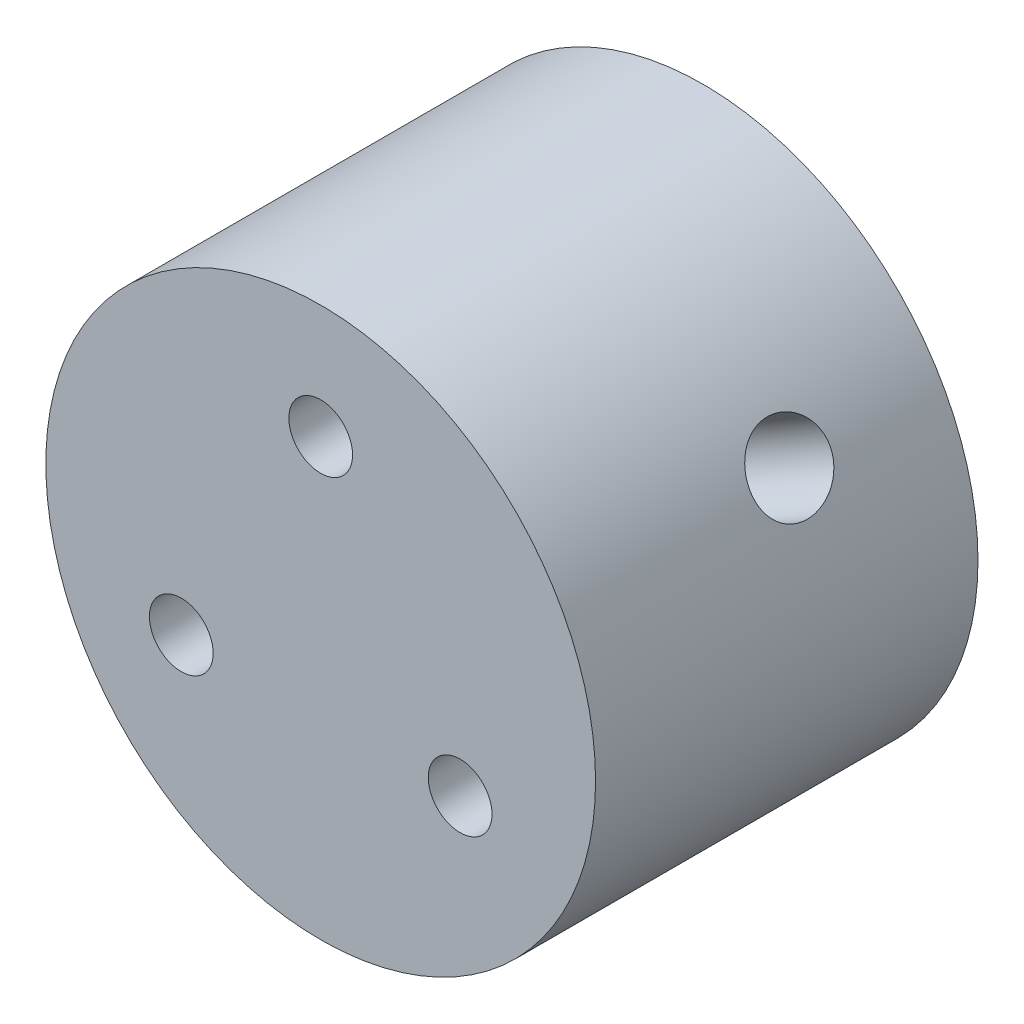
ISO-10303-21;
HEADER;
FILE_DESCRIPTION(('STEP AP214'),'2;1');
FILE_NAME('part.step','',(''),(''),'','','');
FILE_SCHEMA(('AUTOMOTIVE_DESIGN { 1 0 10303 214 1 1 1 1 }'));
ENDSEC;
DATA;
#1=APPLICATION_CONTEXT('core data for automotive mechanical design processes');
#2=APPLICATION_PROTOCOL_DEFINITION('international standard','automotive_design',2000,#1);
#3=PRODUCT_CONTEXT('',#1,'mechanical');
#4=PRODUCT('Part','Part','',(#3));
#5=PRODUCT_RELATED_PRODUCT_CATEGORY('part','',(#4));
#6=PRODUCT_DEFINITION_FORMATION('','',#4);
#7=PRODUCT_DEFINITION_CONTEXT('part definition',#1,'design');
#8=PRODUCT_DEFINITION('design','',#6,#7);
#9=PRODUCT_DEFINITION_SHAPE('','',#8);
#10=(LENGTH_UNIT() NAMED_UNIT(*) SI_UNIT(.MILLI.,.METRE.));
#11=(NAMED_UNIT(*) PLANE_ANGLE_UNIT() SI_UNIT($,.RADIAN.));
#12=(NAMED_UNIT(*) SI_UNIT($,.STERADIAN.) SOLID_ANGLE_UNIT());
#13=UNCERTAINTY_MEASURE_WITH_UNIT(LENGTH_MEASURE(1.E-05),#10,'distance_accuracy_value','');
#14=(GEOMETRIC_REPRESENTATION_CONTEXT(3) GLOBAL_UNCERTAINTY_ASSIGNED_CONTEXT((#13)) GLOBAL_UNIT_ASSIGNED_CONTEXT((#10,
#11,#12)) REPRESENTATION_CONTEXT('',''));
#15=CARTESIAN_POINT('',(0.,0.,0.));
#16=DIRECTION('',(0.,0.,1.));
#17=DIRECTION('',(1.,0.,0.));
#18=AXIS2_PLACEMENT_3D('',#15,#16,#17);
#19=CARTESIAN_POINT('',(0.,0.,48.));
#20=DIRECTION('',(0.,0.,-1.));
#21=DIRECTION('',(-1.,0.,0.));
#22=AXIS2_PLACEMENT_3D('',#19,#20,#21);
#23=CYLINDRICAL_SURFACE('',#22,34.5);
#24=CARTESIAN_POINT('',(-27.0624339322728,21.3980062076206,19.));
#25=CARTESIAN_POINT('',(-27.062432378259,21.3980074335611,19.1396811536221));
#26=CARTESIAN_POINT('',(-27.066105505621,21.3933649615511,19.279336303075));
#27=CARTESIAN_POINT('',(-27.0807519140724,21.3748221823608,19.5576893388665));
#28=CARTESIAN_POINT('',(-27.091726758129,21.360919893072,19.6963870138294));
#29=CARTESIAN_POINT('',(-27.1208594669716,21.3239192747357,19.9718821731124));
#30=CARTESIAN_POINT('',(-27.1390223267006,21.3008145508563,20.1086782674564));
#31=CARTESIAN_POINT('',(-27.1823242689643,21.2455284651499,20.3793537740703));
#32=CARTESIAN_POINT('',(-27.207465909831,21.2133437746523,20.5132320972744));
#33=CARTESIAN_POINT('',(-27.2643987102191,21.1401208395038,20.7769264216718));
#34=CARTESIAN_POINT('',(-27.2961823553729,21.0990925982832,20.9067468245692));
#35=CARTESIAN_POINT('',(-27.3660682832039,21.0083693903759,21.1616259617749));
#36=CARTESIAN_POINT('',(-27.4041728937342,20.9586712304259,21.2866829208852));
#37=CARTESIAN_POINT('',(-27.4862480899361,20.8509171943618,21.5310568049867));
#38=CARTESIAN_POINT('',(-27.5302155934857,20.79286570833,21.6503767014126));
#39=CARTESIAN_POINT('',(-27.623573979753,20.6686766618153,21.8825727148244));
#40=CARTESIAN_POINT('',(-27.672966873776,20.6025361015062,21.9954464183422));
#41=CARTESIAN_POINT('',(-27.776970731533,20.4621009946115,22.2146237177126));
#42=CARTESIAN_POINT('',(-27.8316127160769,20.3877575319849,22.3208812550878));
#43=CARTESIAN_POINT('',(-27.9453025481956,20.23164329573,22.5253467604931));
#44=CARTESIAN_POINT('',(-28.004352018596,20.1498697839432,22.6235517353811));
#45=CARTESIAN_POINT('',(-28.1262231320909,19.9794029893045,22.8111579681904));
#46=CARTESIAN_POINT('',(-28.1890435872609,19.8907118830048,22.9005619753809));
#47=CARTESIAN_POINT('',(-28.3178791557431,19.7068597864432,23.0700074073955));
#48=CARTESIAN_POINT('',(-28.3838954386103,19.6116964223353,23.1500453674104));
#49=CARTESIAN_POINT('',(-28.5187467165314,19.4150804874584,23.3004633455947));
#50=CARTESIAN_POINT('',(-28.5875922056008,19.3136036168492,23.370802207607));
#51=CARTESIAN_POINT('',(-28.7272222380825,19.1052985706319,23.5009441983494));
#52=CARTESIAN_POINT('',(-28.798007492842,18.99846841965,23.5607434005993));
#53=CARTESIAN_POINT('',(-28.9408224951166,18.780196348426,23.6693112397603));
#54=CARTESIAN_POINT('',(-29.0128517220236,18.6687563314362,23.7180843762251));
#55=CARTESIAN_POINT('',(-29.157547350558,18.4419519854754,23.8042801186226));
#56=CARTESIAN_POINT('',(-29.2302139756484,18.3265862357531,23.8416985655615));
#57=CARTESIAN_POINT('',(-29.4471550533404,17.9774678759683,23.935961705267));
#58=CARTESIAN_POINT('',(-29.5915453473279,17.7389054260518,23.9757015416059));
#59=CARTESIAN_POINT('',(-29.8756808704555,17.2560800139875,24.0078723393638));
#60=CARTESIAN_POINT('',(-30.0154263410687,17.0118173493073,24.0003057640073));
#61=CARTESIAN_POINT('',(-30.2854075278283,16.5263614845207,23.9383998980575));
#62=CARTESIAN_POINT('',(-30.4157066743588,16.2851590006362,23.8844116255055));
#63=CARTESIAN_POINT('',(-30.6648018210252,15.8111255500393,23.7317286681408));
#64=CARTESIAN_POINT('',(-30.7835975411898,15.5782947871652,23.6330328955648));
#65=CARTESIAN_POINT('',(-31.0077643383555,15.127203064434,23.3933785432124));
#66=CARTESIAN_POINT('',(-31.1130862894941,14.908996728946,23.2522712580146));
#67=CARTESIAN_POINT('',(-31.3082104672409,14.4947736287041,22.9319066846693));
#68=CARTESIAN_POINT('',(-31.3980117386625,14.2987582298993,22.7526470500322));
#69=CARTESIAN_POINT('',(-31.5618486944441,13.93342162128,22.3591082918331));
#70=CARTESIAN_POINT('',(-31.6357320435591,13.7643620513244,22.1445227242422));
#71=CARTESIAN_POINT('',(-31.7661125038639,13.4607386472375,21.6874669495281));
#72=CARTESIAN_POINT('',(-31.8226095210322,13.3261749996533,21.4449965916197));
#73=CARTESIAN_POINT('',(-31.9179803945846,13.0961109976948,20.9387485144721));
#74=CARTESIAN_POINT('',(-31.9568420100665,13.0006377808448,20.6749561445887));
#75=CARTESIAN_POINT('',(-32.0167715895902,12.8523458602228,20.1337165816403));
#76=CARTESIAN_POINT('',(-32.0378407203525,12.7995243596263,19.8562702851778));
#77=CARTESIAN_POINT('',(-32.0620443347773,12.7387750297312,19.2982879233041));
#78=CARTESIAN_POINT('',(-32.0653394388819,12.7304451450529,19.0178025611778));
#79=CARTESIAN_POINT('',(-32.0544233532874,12.7579055206322,18.4593508668561));
#80=CARTESIAN_POINT('',(-32.0402126694863,12.7936945059026,18.1813844620994));
#81=CARTESIAN_POINT('',(-31.994412770818,12.9077985493021,17.6371791758897));
#82=CARTESIAN_POINT('',(-31.9629045566277,12.9859153731322,17.3708918327573));
#83=CARTESIAN_POINT('',(-31.8826341898198,13.1817590032483,16.8560779496545));
#84=CARTESIAN_POINT('',(-31.8338712375033,13.2994876453959,16.6075522335174));
#85=CARTESIAN_POINT('',(-31.7188709520665,13.5714810777314,16.133391586281));
#86=CARTESIAN_POINT('',(-31.6525129444351,13.7259973964214,15.907930236263));
#87=CARTESIAN_POINT('',(-31.5028991727562,14.0659784301217,15.4880799299139));
#88=CARTESIAN_POINT('',(-31.4196425186108,14.251444775263,15.2936926113016));
#89=CARTESIAN_POINT('',(-31.2363159262727,14.6489163450975,14.9399763822613));
#90=CARTESIAN_POINT('',(-31.1361206541505,14.8611161546788,14.7809309273419));
#91=CARTESIAN_POINT('',(-30.9207465939507,15.3041822423588,14.5043863838868));
#92=CARTESIAN_POINT('',(-30.8055681934024,15.5350480376148,14.3868862210999));
#93=CARTESIAN_POINT('',(-30.5627862598416,16.0073848505066,14.1972189604037));
#94=CARTESIAN_POINT('',(-30.4352275221049,16.2488160174629,14.1248949847653));
#95=CARTESIAN_POINT('',(-30.1701535162243,16.735843890318,14.0271430586428));
#96=CARTESIAN_POINT('',(-30.0326388606292,16.9814403392325,14.0017122255506));
#97=CARTESIAN_POINT('',(-29.8225481612858,17.3460453379166,13.9992737523232));
#98=CARTESIAN_POINT('',(-29.7521772013637,17.4664634717714,14.0043196651362));
#99=CARTESIAN_POINT('',(-29.6104584943827,17.7056488234044,14.0260392538203));
#100=CARTESIAN_POINT('',(-29.5391111222391,17.8244166414082,14.0427085829848));
#101=CARTESIAN_POINT('',(-29.395960977944,18.0595251232147,14.0875629399824));
#102=CARTESIAN_POINT('',(-29.324158051117,18.1758648979859,14.1157521106829));
#103=CARTESIAN_POINT('',(-29.1807233893489,18.4052620343925,14.1834202629379));
#104=CARTESIAN_POINT('',(-29.1090916018578,18.5183205686913,14.2228951550347));
#105=CARTESIAN_POINT('',(-28.9665969724545,18.7404286939835,14.3128350674625));
#106=CARTESIAN_POINT('',(-28.895733916404,18.8494794227155,14.3632969401914));
#107=CARTESIAN_POINT('',(-28.7553963055681,19.0628824679722,14.4748300814823));
#108=CARTESIAN_POINT('',(-28.6859212595868,19.167236463586,14.5358975199888));
#109=CARTESIAN_POINT('',(-28.5489288627992,19.3706920160596,14.6682429350668));
#110=CARTESIAN_POINT('',(-28.4814122617839,19.4697915729706,14.7395247617651));
#111=CARTESIAN_POINT('',(-28.3490092534541,19.662077669385,14.8917525203313));
#112=CARTESIAN_POINT('',(-28.2841219200766,19.7552662974506,14.9726950092494));
#113=CARTESIAN_POINT('',(-28.156986957563,19.9360580658387,15.1444844123258));
#114=CARTESIAN_POINT('',(-28.0947688105816,20.0236024944788,15.2354149469376));
#115=CARTESIAN_POINT('',(-27.974245605206,20.1916386765307,15.4258978837172));
#116=CARTESIAN_POINT('',(-27.9159391455184,20.2721329587254,15.5254471687795));
#117=CARTESIAN_POINT('',(-27.8037719827395,20.4257022637268,15.7325697162863));
#118=CARTESIAN_POINT('',(-27.7499139766517,20.4987727917542,15.8401477722614));
#119=CARTESIAN_POINT('',(-27.6472638877794,20.6370107143001,16.062490734272));
#120=CARTESIAN_POINT('',(-27.5984699422377,20.7021810163198,16.1772529726062));
#121=CARTESIAN_POINT('',(-27.506189498586,20.8246357184986,16.4138704555592));
#122=CARTESIAN_POINT('',(-27.4627343144749,20.8818738224466,16.5357618836751));
#123=CARTESIAN_POINT('',(-27.3819510461969,20.9876913495253,16.7851441504622));
#124=CARTESIAN_POINT('',(-27.3446207111576,21.0362739541047,16.9126329101909));
#125=CARTESIAN_POINT('',(-27.2765186229426,21.1245032901575,17.1722575429742));
#126=CARTESIAN_POINT('',(-27.2457419916817,21.1641566691486,17.3043898737517));
#127=CARTESIAN_POINT('',(-27.1910778142365,21.2343415285726,17.5724011690971));
#128=CARTESIAN_POINT('',(-27.1671887059592,21.2648750774432,17.7082792764499));
#129=CARTESIAN_POINT('',(-27.1189534124847,21.3263792814157,18.0343993732283));
#130=CARTESIAN_POINT('',(-27.0977965823854,21.3532183302098,18.2259162745531));
#131=CARTESIAN_POINT('',(-27.0695380042923,21.3890308370826,18.6116388854967));
#132=CARTESIAN_POINT('',(-27.0624360923367,21.3980045035753,18.8058445637222));
#133=CARTESIAN_POINT('',(-27.0624339322728,21.3980062076206,19.));
#134=B_SPLINE_CURVE_WITH_KNOTS('',3,(#24,#25,#26,#27,#28,#29,#30,#31,#32,#33,#34,#35,#36,#37,
#38,#39,#40,#41,#42,#43,#44,#45,#46,#47,#48,#49,#50,#51,#52,#53,#54,#55,#56,#57,#58,#59,#60,#61,
#62,#63,#64,#65,#66,#67,#68,#69,#70,#71,#72,#73,#74,#75,#76,#77,#78,#79,#80,#81,#82,#83,#84,#85,
#86,#87,#88,#89,#90,#91,#92,#93,#94,#95,#96,#97,#98,#99,#100,#101,#102,#103,#104,#105,#106,#107,
#108,#109,#110,#111,#112,#113,#114,#115,#116,#117,#118,#119,#120,#121,#122,#123,#124,#125,#126,
#127,#128,#129,#130,#131,#132,#133),.UNSPECIFIED.,.T.,.F.,(4,2,2,2,2,2,2,2,2,2,2,2,2,2,2,2,2,2,
2,2,2,2,2,2,2,2,2,2,2,2,2,2,2,2,2,2,2,2,2,2,2,2,2,2,2,2,2,2,2,2,2,2,2,2,4),(0.,
0.418873384797761,0.837836460289055,1.25709118533762,1.67649980724655,2.09543647942797,
2.51452777940979,2.93339962539417,3.35242728336616,3.77410460824124,4.19593796694443,
4.61763913128663,5.03949580689117,5.46309081168777,5.88684329195409,6.31042253247804,
6.73415673478369,7.5747644583788,8.41532841225427,9.24959177478529,10.0838754365914,
10.921119124664,11.7584143207467,12.6033977804718,13.4483858096019,14.2939594593115,
15.1394776572507,15.9773421091499,16.8151823482507,17.6491322170659,18.4831207417042,
19.3229841045516,20.1628917167849,21.0093103218027,21.8557070390787,22.6991479969593,
23.5425371052365,23.9608212293198,24.3789490152013,24.7972273044072,25.2153542193204,
25.6333615045102,26.0512181447876,26.46923270482,26.8870987316,27.3087769082443,
27.7303032104317,28.1520832273616,28.573707543284,28.9976974287552,29.4215311478941,
29.8450482857167,30.2684692939876,30.8507059910492,31.432935895812),.UNSPECIFIED.);
#135=CARTESIAN_POINT('',(-27.0624339322728,21.3980062076206,19.));
#136=VERTEX_POINT('',#135);
#137=EDGE_CURVE('E69',#136,#136,#134,.T.);
#138=ORIENTED_EDGE('',*,*,#137,.T.);
#139=EDGE_LOOP('',(#138));
#140=FACE_BOUND('',#139,.T.);
#141=CARTESIAN_POINT('',(32.062433932273,12.7377521697758,19.));
#142=CARTESIAN_POINT('',(32.0624342169618,12.7377502109901,19.1396811536221));
#143=CARTESIAN_POINT('',(32.0602502819457,12.7432524686019,19.279336303075));
#144=CARTESIAN_POINT('',(32.0515149683359,12.7652080199902,19.5576893388665));
#145=CARTESIAN_POINT('',(32.0449626546693,12.7816636583902,19.6963870138294));
#146=CARTESIAN_POINT('',(32.0274855336556,12.8253936334971,19.9718821731124));
#147=CARTESIAN_POINT('',(32.0165576856932,12.8526754933675,20.1086782674564));
#148=CARTESIAN_POINT('',(31.9903295021274,12.9178191182543,20.3793537740703));
#149=CARTESIAN_POINT('',(31.9750275629769,12.9556847631864,20.5132320972744));
#150=CARTESIAN_POINT('',(31.9400810411927,13.0416014822053,20.7769264216718));
#151=CARTESIAN_POINT('',(31.9204413646,13.0896410469438,20.9067468245692));
#152=CARTESIAN_POINT('',(31.8768157257549,13.1955256397661,21.1616259617749));
#153=CARTESIAN_POINT('',(31.852828161982,13.2533742804617,21.2866829208852));
#154=CARTESIAN_POINT('',(31.8005480274912,13.3783305034251,21.5310568049867));
#155=CARTESIAN_POINT('',(31.772257717635,13.445433221456,21.6503767014127));
#156=CARTESIAN_POINT('',(31.7113860416152,13.5883784788771,21.8825727148244));
#157=CARTESIAN_POINT('',(31.6788030831785,13.664224260022,21.9954464183422));
#158=CARTESIAN_POINT('',(31.609184641903,13.8245117963785,22.2146237177126));
#159=CARTESIAN_POINT('',(31.572122306935,13.9090048744201,22.3208812550879));
#160=CARTESIAN_POINT('',(31.4937683285052,14.0855202753143,22.5253467604931));
#161=CARTESIAN_POINT('',(31.4524751251414,14.1775453726544,22.6235517353811));
#162=CARTESIAN_POINT('',(31.36578210723,14.3683222502479,22.8111579681904));
#163=CARTESIAN_POINT('',(31.3203835836697,14.4670719134522,22.9005619753809));
#164=CARTESIAN_POINT('',(31.2255807817494,14.6705728369496,23.0700074073955));
#165=CARTESIAN_POINT('',(31.176175032356,14.77532629703,23.1500453674104));
#166=CARTESIAN_POINT('',(31.0733262769243,14.9904188968809,23.3004633455947));
#167=CARTESIAN_POINT('',(31.0198674736149,15.1007792746555,23.370802207607));
#168=CARTESIAN_POINT('',(30.9092850280951,15.3258549530246,23.5009441983494));
#169=CARTESIAN_POINT('',(30.8521600308344,15.4405718573507,23.5607434005993));
#170=CARTESIAN_POINT('',(30.734538373355,15.6733893129739,23.6693112397603));
#171=CARTESIAN_POINT('',(30.6740431010972,15.7914884617853,23.7180843762251));
#172=CARTESIAN_POINT('',(30.5499725900736,16.0302007248931,23.8042801186226));
#173=CARTESIAN_POINT('',(30.4863962326327,16.1508147430898,23.8416985655615));
#174=CARTESIAN_POINT('',(30.2925214029775,16.5132504073879,23.935961705267));
#175=CARTESIAN_POINT('',(30.1581154079545,16.7575772949991,23.9757015416059));
#176=CARTESIAN_POINT('',(29.882044097078,17.2450585821774,24.0078723393638));
#177=CARTESIAN_POINT('',(29.7403791595754,17.4882130421323,24.0003057640073));
#178=CARTESIAN_POINT('',(29.4549526416338,17.9647515408033,23.9383998980575));
#179=CARTESIAN_POINT('',(29.3112147363992,18.1981951537324,23.8844116255055));
#180=CARTESIAN_POINT('',(29.025237299272,18.6509346040034,23.7317286681408));
#181=CARTESIAN_POINT('',(28.8829978039227,18.8702300969638,23.6330328955648));
#182=CARTESIAN_POINT('',(28.6044243111835,19.2899100993599,23.3933785432124));
#183=CARTESIAN_POINT('',(28.4681130569535,19.4902247523661,23.2522712580146));
#184=CARTESIAN_POINT('',(28.2069474181831,19.8663187973083,22.9319066846693));
#185=CARTESIAN_POINT('',(28.082093738996,20.042096679054,22.7526470500322));
#186=CARTESIAN_POINT('',(27.84762143289,20.3666519491492,22.3591082918331));
#187=CARTESIAN_POINT('',(27.7381532251131,20.5151665913773,22.1445227242422));
#188=CARTESIAN_POINT('',(27.5403978741427,20.7798910842017,21.6874669495281));
#189=CARTESIAN_POINT('',(27.452110845493,20.8961007600997,21.4449965916197));
#190=CARTESIAN_POINT('',(27.3005550120768,21.0937263603564,20.9387485144721));
#191=CARTESIAN_POINT('',(27.2373035886447,21.1751181150209,20.6749561445887));
#192=CARTESIAN_POINT('',(27.1388438079719,21.3011646136375,20.1337165816403));
#193=CARTESIAN_POINT('',(27.1036336119705,21.3458217664115,19.8562702851778));
#194=CARTESIAN_POINT('',(27.0631249562308,21.3971573763144,19.2982879233041));
#195=CARTESIAN_POINT('',(27.0575586165412,21.4041759625162,19.0178025611778));
#196=CARTESIAN_POINT('',(27.075881956593,21.3809921672918,18.4593508668561));
#197=CARTESIAN_POINT('',(27.0997707851123,21.3507908614798,18.1813844620994));
#198=CARTESIAN_POINT('',(27.1756878360366,21.2540749640424,17.6371791758897));
#199=CARTESIAN_POINT('',(27.2275848828413,21.1877296382107,17.3708918327573));
#200=CARTESIAN_POINT('',(27.3570552582872,21.0202916463259,16.8560779496545));
#201=CARTESIAN_POINT('',(27.4346297769819,20.9191973697826,16.6075522335174));
#202=CARTESIAN_POINT('',(27.6126828563285,20.683607484984,16.133391586281));
#203=CARTESIAN_POINT('',(27.7133189097977,20.5488816052857,15.907930236263));
#204=CARTESIAN_POINT('',(27.9329442359476,20.2493217614057,15.4880799299139));
#205=CARTESIAN_POINT('',(28.0519344753143,20.0844862113111,15.2936926113016));
#206=CARTESIAN_POINT('',(28.3044916559039,19.7269849402397,14.9399763822613));
#207=CARTESIAN_POINT('',(28.4381644456185,19.5341133844521,14.7809309273419));
#208=CARTESIAN_POINT('',(28.7141839030048,19.1260609331629,14.5043863838868));
#209=CARTESIAN_POINT('',(28.8565303462873,18.9108806146928,14.3868862210999));
#210=CARTESIAN_POINT('',(29.1441950586138,18.4644568862033,14.1972189604037));
#211=CARTESIAN_POINT('',(29.2895012135949,18.2332721953705,14.1248949847653));
#212=CARTESIAN_POINT('',(29.5787427208982,17.7601974359675,14.0271430586428));
#213=CARTESIAN_POINT('',(29.7226781569399,17.5183080263723,14.0017122255506));
#214=CARTESIAN_POINT('',(29.9333899984754,17.1540616442999,13.9992737523232));
#215=CARTESIAN_POINT('',(30.0024896815089,17.0329095383913,14.0043196651362));
#216=CARTESIAN_POINT('',(30.1387709187457,16.7905848621378,14.0260392538203));
#217=CARTESIAN_POINT('',(30.2059531802172,16.6694123163663,14.0427085829848));
#218=CARTESIAN_POINT('',(30.3379880259593,16.4278864139481,14.0875629399824));
#219=CARTESIAN_POINT('',(30.4028397629682,16.3075333678642,14.1157521106829));
#220=CARTESIAN_POINT('',(30.5297861797677,16.0686167387865,14.1834202629379));
#221=CARTESIAN_POINT('',(30.5918818488395,15.9500525239513,14.2228951550347));
#222=CARTESIAN_POINT('',(30.7129858130278,15.7155944923391,14.3128350674625));
#223=CARTESIAN_POINT('',(30.7719949863857,15.5996999212436,14.3632969401914));
#224=CARTESIAN_POINT('',(30.8866386394051,15.3714624625249,14.4748300814823));
#225=CARTESIAN_POINT('',(30.9422743276024,15.2591183099692,14.5358975199888));
#226=CARTESIAN_POINT('',(31.0499758061917,15.0387516379889,14.6682429350668));
#227=CARTESIAN_POINT('',(31.1020402394728,14.930730767877,14.7395247617651));
#228=CARTESIAN_POINT('',(31.2023633795973,14.7199233509187,14.8917525203313));
#229=CARTESIAN_POINT('',(31.2506234321571,14.6171349577972,14.9726950092494));
#230=CARTESIAN_POINT('',(31.3436262151196,14.4166369663572,15.1444844123258));
#231=CARTESIAN_POINT('',(31.388332840791,14.3189822561748,15.2354149469377));
#232=CARTESIAN_POINT('',(31.4735948405151,14.1305880075481,15.4258978837172));
#233=CARTESIAN_POINT('',(31.5141517039112,14.0398459911566,15.5254471687795));
#234=CARTESIAN_POINT('',(31.5910630418945,13.8659217262189,15.7325697162863));
#235=CARTESIAN_POINT('',(31.6274149723903,13.782744060736,15.8401477722614));
#236=CARTESIAN_POINT('',(31.6958074806453,13.6247275147989,16.062490734272));
#237=CARTESIAN_POINT('',(31.7278496449958,13.549885567399,16.1772529726062));
#238=CARTESIAN_POINT('',(31.7877583060697,13.4087410078348,16.4138704555592));
#239=CARTESIAN_POINT('',(31.8156003660975,13.3424886624944,16.5357618836751));
#240=CARTESIAN_POINT('',(31.8668493985743,13.2196195364257,16.7851441504622));
#241=CARTESIAN_POINT('',(31.8902580008024,13.1629992156601,16.9126329101909));
#242=CARTESIAN_POINT('',(31.9326158030757,13.0599064091887,17.1722575429742));
#243=CARTESIAN_POINT('',(31.9515683209974,13.0134263751783,17.3043898737517));
#244=CARTESIAN_POINT('',(31.985018103497,12.9309933791218,17.5724011690971));
#245=CARTESIAN_POINT('',(31.999516378348,12.8950380300446,17.7082792764499));
#246=CARTESIAN_POINT('',(32.0286629346905,12.8225129385504,18.0343993732283));
#247=CARTESIAN_POINT('',(32.04132781771,12.7907710618238,18.2259162745531));
#248=CARTESIAN_POINT('',(32.0582130693885,12.748392161884,18.6116388854967));
#249=CARTESIAN_POINT('',(32.0624335365584,12.7377548924687,18.8058445637222));
#250=CARTESIAN_POINT('',(32.062433932273,12.7377521697758,19.));
#251=B_SPLINE_CURVE_WITH_KNOTS('',3,(#141,#142,#143,#144,#145,#146,#147,#148,#149,#150,#151,
#152,#153,#154,#155,#156,#157,#158,#159,#160,#161,#162,#163,#164,#165,#166,#167,#168,#169,#170,
#171,#172,#173,#174,#175,#176,#177,#178,#179,#180,#181,#182,#183,#184,#185,#186,#187,#188,#189,
#190,#191,#192,#193,#194,#195,#196,#197,#198,#199,#200,#201,#202,#203,#204,#205,#206,#207,#208,
#209,#210,#211,#212,#213,#214,#215,#216,#217,#218,#219,#220,#221,#222,#223,#224,#225,#226,#227,
#228,#229,#230,#231,#232,#233,#234,#235,#236,#237,#238,#239,#240,#241,#242,#243,#244,#245,#246,
#247,#248,#249,#250),.UNSPECIFIED.,.T.,.F.,(4,2,2,2,2,2,2,2,2,2,2,2,2,2,2,2,2,2,2,2,2,2,2,2,2,2,
2,2,2,2,2,2,2,2,2,2,2,2,2,2,2,2,2,2,2,2,2,2,2,2,2,2,2,2,4),(0.,0.418873384797758,
0.837836460289055,1.25709118533762,1.67649980724655,2.09543647942797,2.51452777940979,
2.93339962539418,3.35242728336616,3.77410460824125,4.19593796694443,4.61763913128663,
5.03949580689117,5.46309081168777,5.88684329195409,6.31042253247804,6.73415673478369,
7.57476445837881,8.41532841225427,9.24959177478529,10.0838754365914,10.921119124664,
11.7584143207467,12.6033977804718,13.4483858096019,14.2939594593115,15.1394776572507,
15.9773421091499,16.8151823482507,17.6491322170659,18.4831207417042,19.3229841045516,
20.1628917167849,21.0093103218027,21.8557070390787,22.6991479969593,23.5425371052365,
23.9608212293198,24.3789490152013,24.7972273044072,25.2153542193204,25.6333615045102,
26.0512181447876,26.46923270482,26.8870987316,27.3087769082443,27.7303032104317,
28.1520832273616,28.573707543284,28.9976974287552,29.4215311478941,29.8450482857167,
30.2684692939876,30.8507059910492,31.432935895812),.UNSPECIFIED.);
#252=CARTESIAN_POINT('',(32.062433932273,12.7377521697758,19.));
#253=VERTEX_POINT('',#252);
#254=EDGE_CURVE('E60',#253,#253,#251,.T.);
#255=ORIENTED_EDGE('',*,*,#254,.T.);
#256=EDGE_LOOP('',(#255));
#257=FACE_BOUND('',#256,.T.);
#258=CARTESIAN_POINT('',(0.,-34.5,24.));
#259=CARTESIAN_POINT('',(0.139689818065338,-34.5000007051837,24.0000018370424));
#260=CARTESIAN_POINT('',(0.27935363208225,-34.4991499702517,23.9941440552333));
#261=CARTESIAN_POINT('',(0.557724230848581,-34.4957723113589,23.9707593887931));
#262=CARTESIAN_POINT('',(0.696430804371939,-34.4932450286902,23.9532300069466));
#263=CARTESIAN_POINT('',(0.9719439548344,-34.4865819187669,23.9066140930778));
#264=CARTESIAN_POINT('',(1.10874914433517,-34.482444974839,23.8775195376229));
#265=CARTESIAN_POINT('',(1.37944303424331,-34.4726773851782,23.8079799169434));
#266=CARTESIAN_POINT('',(1.51333064612,-34.4670461919359,23.7675306909279));
#267=CARTESIAN_POINT('',(1.77704472979558,-34.4544557497779,23.6756377343697));
#268=CARTESIAN_POINT('',(1.90687556257475,-34.447497988382,23.6242063108115));
#269=CARTESIAN_POINT('',(2.16177466440575,-34.4324416554255,23.5106765747636));
#270=CARTESIAN_POINT('',(2.28684115811077,-34.424342663787,23.448574332576));
#271=CARTESIAN_POINT('',(2.53123241001507,-34.4072356059039,23.3141973235436));
#272=CARTESIAN_POINT('',(2.65056014594458,-34.3982280187944,23.2419279103595));
#273=CARTESIAN_POINT('',(2.88276968674275,-34.3795464506311,23.0876735786396));
#274=CARTESIAN_POINT('',(2.99564907748692,-34.369872222953,23.0056850563433));
#275=CARTESIAN_POINT('',(3.21481859626601,-34.350067327095,22.8320500764228));
#276=CARTESIAN_POINT('',(3.32106376247753,-34.3399342105896,22.740347140934));
#277=CARTESIAN_POINT('',(3.52550441384205,-34.3195480494129,22.5483087166174));
#278=CARTESIAN_POINT('',(3.62369690595885,-34.309294961754,22.4479700461838));
#279=CARTESIAN_POINT('',(3.81127871723101,-34.2889640361817,22.2394164002987));
#280=CARTESIAN_POINT('',(3.90067076798666,-34.2788861446935,22.1312038870894));
#281=CARTESIAN_POINT('',(4.07009320913557,-34.2591829966624,21.9075808933052));
#282=CARTESIAN_POINT('',(4.1501201342206,-34.2495579084498,21.7921677724085));
#283=CARTESIAN_POINT('',(4.30052559630811,-34.2309983602264,21.5544748261872));
#284=CARTESIAN_POINT('',(4.37086190945984,-34.2220669922425,21.432168031613));
#285=CARTESIAN_POINT('',(4.50099854006384,-34.2051943307637,21.181950754193));
#286=CARTESIAN_POINT('',(4.5607949307969,-34.1972534065861,21.0540382049524));
#287=CARTESIAN_POINT('',(4.66935698501973,-34.1825995890939,20.7935968639766));
#288=CARTESIAN_POINT('',(4.71812716140857,-34.1758861935822,20.6610699865545));
#289=CARTESIAN_POINT('',(4.80431687270855,-34.1638757287357,20.3922985865416));
#290=CARTESIAN_POINT('',(4.84173224969593,-34.158579178308,20.2560527219815));
#291=CARTESIAN_POINT('',(4.93598669808495,-34.145135397486,19.8452232563782));
#292=CARTESIAN_POINT('',(4.97571984693311,-34.1393102818569,19.5664150690971));
#293=CARTESIAN_POINT('',(5.00787315974064,-34.1346076581074,19.0061848481093));
#294=CARTESIAN_POINT('',(5.0002958623203,-34.135729777207,18.7247629554598));
#295=CARTESIAN_POINT('',(4.93837275056611,-34.1447422961832,18.1694018153331));
#296=CARTESIAN_POINT('',(4.88438875736362,-34.1525803322372,17.8954215529572));
#297=CARTESIAN_POINT('',(4.73173393980025,-34.1740629659404,17.3604603237847));
#298=CARTESIAN_POINT('',(4.63306192846248,-34.1877077178237,17.0994797024814));
#299=CARTESIAN_POINT('',(4.39345732160263,-34.2193237181954,16.5968066384993));
#300=CARTESIAN_POINT('',(4.25237056812282,-34.2373107008917,16.3551886979907));
#301=CARTESIAN_POINT('',(3.93205011163047,-34.2755731836978,15.8989207584741));
#302=CARTESIAN_POINT('',(3.75281406917767,-34.2958488241199,15.6842724146151));
#303=CARTESIAN_POINT('',(3.3592923894242,-34.3366357832656,15.2859375203383));
#304=CARTESIAN_POINT('',(3.14469540703887,-34.3571475361895,15.1025584563002));
#305=CARTESIAN_POINT('',(2.68760687297792,-34.3959196691684,14.7743725353431));
#306=CARTESIAN_POINT('',(2.44511521338684,-34.4141800405131,14.6295658276553));
#307=CARTESIAN_POINT('',(1.93886066014738,-34.4464092357637,14.3826226725704));
#308=CARTESIAN_POINT('',(1.67508651380652,-34.460375770367,14.2805089769804));
#309=CARTESIAN_POINT('',(1.13388666539479,-34.4824242140997,14.1221127518462));
#310=CARTESIAN_POINT('',(0.85646182549371,-34.4905064943672,14.0658273317451));
#311=CARTESIAN_POINT('',(0.298490549011581,-34.499826824613,14.0010920129155));
#312=CARTESIAN_POINT('',(0.0179941515664658,-34.5011253822749,13.9922191992046));
#313=CARTESIAN_POINT('',(-0.540482317742549,-34.4968963728193,14.021439823419));
#314=CARTESIAN_POINT('',(-0.818462461949523,-34.4913690025814,14.0595319067408));
#315=CARTESIAN_POINT('',(-1.36274176366782,-34.4741466495462,14.1812493936832));
#316=CARTESIAN_POINT('',(-1.6290877401969,-34.4624794541753,14.2646697071417));
#317=CARTESIAN_POINT('',(-2.14401225726796,-34.4342818371216,14.4744601172261));
#318=CARTESIAN_POINT('',(-2.39259001133029,-34.4177512003324,14.6008321136108));
#319=CARTESIAN_POINT('',(-2.86678791237467,-34.3815144025999,14.8939372920308));
#320=CARTESIAN_POINT('',(-3.0922399000373,-34.3617873504954,15.060939898334));
#321=CARTESIAN_POINT('',(-3.51206735532052,-34.321421119412,15.4301903013907));
#322=CARTESIAN_POINT('',(-3.70644114189259,-34.3007818911697,15.6324400034562));
#323=CARTESIAN_POINT('',(-4.06012555313532,-34.260726588361,16.0683182622996));
#324=CARTESIAN_POINT('',(-4.21915334896935,-34.2413212091647,16.3021774233748));
#325=CARTESIAN_POINT('',(-4.49566694148287,-34.2061178034467,16.7935481851977));
#326=CARTESIAN_POINT('',(-4.61315380091396,-34.1903196846432,17.0510591806425));
#327=CARTESIAN_POINT('',(-4.80281279819231,-34.164194232133,17.5815124847594));
#328=CARTESIAN_POINT('',(-4.87513605889873,-34.1538486718368,17.8543999630999));
#329=CARTESIAN_POINT('',(-4.9728788900081,-34.139757190895,18.4087633770927));
#330=CARTESIAN_POINT('',(-4.99830146613919,-34.1360108473256,18.6902387611957));
#331=CARTESIAN_POINT('',(-5.00072119393696,-34.1356509169154,19.1110472097383));
#332=CARTESIAN_POINT('',(-4.99567045403229,-34.1363935461174,19.2504994070562));
#333=CARTESIAN_POINT('',(-4.97394434758889,-34.1395669428088,19.5284619103846));
#334=CARTESIAN_POINT('',(-4.95727332720433,-34.1419970791447,19.6669725490005));
#335=CARTESIAN_POINT('',(-4.91241884985801,-34.1484793906146,19.9421192260877));
#336=CARTESIAN_POINT('',(-4.88423123839306,-34.1525321510845,20.0787545696596));
#337=CARTESIAN_POINT('',(-4.8165696163839,-34.1621402317787,20.3490969045812));
#338=CARTESIAN_POINT('',(-4.77709969153236,-34.1676950080349,20.4828049371688));
#339=CARTESIAN_POINT('',(-4.68717412010465,-34.1801471028916,20.7463623269102));
#340=CARTESIAN_POINT('',(-4.63672185358725,-34.187044008353,20.8762128573522));
#341=CARTESIAN_POINT('',(-4.52521164458867,-34.2019827033847,21.1311521843674));
#342=CARTESIAN_POINT('',(-4.46415752901128,-34.210024079652,21.2562426793546));
#343=CARTESIAN_POINT('',(-4.33184200204636,-34.2270301552956,21.5008985054929));
#344=CARTESIAN_POINT('',(-4.26057673197668,-34.2359952033559,21.6204617252544));
#345=CARTESIAN_POINT('',(-4.1083847277849,-34.2545916249741,21.8531553683361));
#346=CARTESIAN_POINT('',(-4.02746143401972,-34.2642227607489,21.9662880612481));
#347=CARTESIAN_POINT('',(-3.8556927617305,-34.2839783864933,22.1864252922318));
#348=CARTESIAN_POINT('',(-3.76476165482684,-34.2941066485164,22.2933626109229));
#349=CARTESIAN_POINT('',(-3.57427497442118,-34.3144827653384,22.4991730979946));
#350=CARTESIAN_POINT('',(-3.47472251905228,-34.3247305757486,22.5980491570261));
#351=CARTESIAN_POINT('',(-3.26759110290733,-34.3450677858823,22.7871527379766));
#352=CARTESIAN_POINT('',(-3.16000736047028,-34.3551570868356,22.8773750334076));
#353=CARTESIAN_POINT('',(-2.93765054759084,-34.3748841472607,23.0484415200344));
#354=CARTESIAN_POINT('',(-2.82288014729457,-34.3845220721386,23.1292891628419));
#355=CARTESIAN_POINT('',(-2.58625627787144,-34.4031312060564,23.2814922350549));
#356=CARTESIAN_POINT('',(-2.46436727273268,-34.4120984498475,23.3527929207713));
#357=CARTESIAN_POINT('',(-2.21498950563554,-34.4290492755067,23.4848323339402));
#358=CARTESIAN_POINT('',(-2.08750282264267,-34.4370332184483,23.5455749417669));
#359=CARTESIAN_POINT('',(-1.82788225777067,-34.451788514843,23.6560422904502));
#360=CARTESIAN_POINT('',(-1.69575191092822,-34.458560767769,23.7057752106825));
#361=CARTESIAN_POINT('',(-1.42774499010887,-34.4707056370342,23.7938967366348));
#362=CARTESIAN_POINT('',(-1.29186927226561,-34.4760785703499,23.8322879117733));
#363=CARTESIAN_POINT('',(-0.965726877773803,-34.486997663625,23.9096857612376));
#364=CARTESIAN_POINT('',(-0.774184713637147,-34.4918521115508,23.9435164275692));
#365=CARTESIAN_POINT('',(-0.388411596695477,-34.4983527716117,23.9886721439006));
#366=CARTESIAN_POINT('',(-0.194180674076362,-34.4999990197349,23.9999974463556));
#367=CARTESIAN_POINT('',(0.,-34.5,24.));
#368=B_SPLINE_CURVE_WITH_KNOTS('',3,(#258,#259,#260,#261,#262,#263,#264,#265,#266,#267,#268,
#269,#270,#271,#272,#273,#274,#275,#276,#277,#278,#279,#280,#281,#282,#283,#284,#285,#286,#287,
#288,#289,#290,#291,#292,#293,#294,#295,#296,#297,#298,#299,#300,#301,#302,#303,#304,#305,#306,
#307,#308,#309,#310,#311,#312,#313,#314,#315,#316,#317,#318,#319,#320,#321,#322,#323,#324,#325,
#326,#327,#328,#329,#330,#331,#332,#333,#334,#335,#336,#337,#338,#339,#340,#341,#342,#343,#344,
#345,#346,#347,#348,#349,#350,#351,#352,#353,#354,#355,#356,#357,#358,#359,#360,#361,#362,#363,
#364,#365,#366,#367),.UNSPECIFIED.,.T.,.F.,(4,2,2,2,2,2,2,2,2,2,2,2,2,2,2,2,2,2,2,2,2,2,2,2,2,2,
2,2,2,2,2,2,2,2,2,2,2,2,2,2,2,2,2,2,2,2,2,2,2,2,2,2,2,2,4),(0.,0.418899407755692,
0.837888470594361,1.2571687192116,1.67660280935707,2.09556931281417,2.51469043930521,
2.93359169225887,3.35264875885577,3.77429187364566,4.19609100205565,4.61775879119457,
5.03958211688018,5.46318890774231,5.88695318412913,6.31054370355343,6.734289147583,
7.57493111461137,8.41552797421457,9.24962975008854,10.0837536821836,10.9209466935785,
11.75819105921,12.6032451894744,13.4483025890893,14.2938097614017,15.1392636003533,
15.9771633435248,16.8150389198087,17.6491546700402,18.4833073181289,19.3231497259495,
20.1630375462627,21.0094215867368,21.855783972401,22.6992989350453,23.5427598373967,
23.9609893244996,24.379062471557,24.7972865679652,25.2153594032812,25.633303748897,
26.0510975433631,26.4690496359102,26.8868532885037,27.308564965644,27.7301247518241,
28.1519375589998,28.573594564316,28.9975743738583,29.4213980285475,29.8449057492838,
30.2683174526543,30.8506296280882,31.4329352713681),.UNSPECIFIED.);
#369=CARTESIAN_POINT('',(0.,-34.5,24.));
#370=VERTEX_POINT('',#369);
#371=EDGE_CURVE('E11',#370,#370,#368,.T.);
#372=ORIENTED_EDGE('',*,*,#371,.T.);
#373=EDGE_LOOP('',(#372));
#374=FACE_BOUND('',#373,.T.);
#375=CARTESIAN_POINT('',(0.,0.,48.));
#376=DIRECTION('',(0.,0.,1.));
#377=DIRECTION('',(1.,0.,0.));
#378=AXIS2_PLACEMENT_3D('',#375,#376,#377);
#379=CIRCLE('',#378,34.5);
#380=CARTESIAN_POINT('',(34.5,0.,48.));
#381=VERTEX_POINT('',#380);
#382=EDGE_CURVE('E46',#381,#381,#379,.T.);
#383=ORIENTED_EDGE('',*,*,#382,.F.);
#384=EDGE_LOOP('',(#383));
#385=FACE_BOUND('',#384,.T.);
#386=CARTESIAN_POINT('',(0.,0.,0.));
#387=DIRECTION('',(0.,0.,1.));
#388=DIRECTION('',(1.,0.,0.));
#389=AXIS2_PLACEMENT_3D('',#386,#387,#388);
#390=CIRCLE('',#389,34.5);
#391=CARTESIAN_POINT('',(34.5,0.,0.));
#392=VERTEX_POINT('',#391);
#393=EDGE_CURVE('E138',#392,#392,#390,.T.);
#394=ORIENTED_EDGE('',*,*,#393,.T.);
#395=EDGE_LOOP('',(#394));
#396=FACE_BOUND('',#395,.T.);
#397=ADVANCED_FACE('F35',(#140,#257,#374,#385,#396),#23,.T.);
#398=CARTESIAN_POINT('',(0.,0.,48.));
#399=DIRECTION('',(0.,0.,1.));
#400=DIRECTION('',(1.,0.,0.));
#401=AXIS2_PLACEMENT_3D('',#398,#399,#400);
#402=PLANE('',#401);
#403=CARTESIAN_POINT('',(-17.5,-10.1036297108185,48.));
#404=DIRECTION('',(0.,0.,1.));
#405=DIRECTION('',(1.,0.,0.));
#406=AXIS2_PLACEMENT_3D('',#403,#404,#405);
#407=CIRCLE('',#406,4.);
#408=CARTESIAN_POINT('',(-13.5,-10.1036297108185,48.));
#409=VERTEX_POINT('',#408);
#410=EDGE_CURVE('E72',#409,#409,#407,.T.);
#411=ORIENTED_EDGE('',*,*,#410,.F.);
#412=EDGE_LOOP('',(#411));
#413=FACE_BOUND('',#412,.T.);
#414=CARTESIAN_POINT('',(17.5,-10.1036297108184,48.));
#415=DIRECTION('',(0.,0.,1.));
#416=DIRECTION('',(1.,0.,0.));
#417=AXIS2_PLACEMENT_3D('',#414,#415,#416);
#418=CIRCLE('',#417,4.);
#419=CARTESIAN_POINT('',(21.5,-10.1036297108184,48.));
#420=VERTEX_POINT('',#419);
#421=EDGE_CURVE('E148',#420,#420,#418,.T.);
#422=ORIENTED_EDGE('',*,*,#421,.F.);
#423=EDGE_LOOP('',(#422));
#424=FACE_BOUND('',#423,.T.);
#425=CARTESIAN_POINT('',(0.,20.2072594216369,48.));
#426=DIRECTION('',(0.,0.,1.));
#427=DIRECTION('',(1.,0.,0.));
#428=AXIS2_PLACEMENT_3D('',#425,#426,#427);
#429=CIRCLE('',#428,4.);
#430=CARTESIAN_POINT('',(4.,20.2072594216369,48.));
#431=VERTEX_POINT('',#430);
#432=EDGE_CURVE('E142',#431,#431,#429,.T.);
#433=ORIENTED_EDGE('',*,*,#432,.F.);
#434=EDGE_LOOP('',(#433));
#435=FACE_BOUND('',#434,.T.);
#436=ORIENTED_EDGE('',*,*,#382,.T.);
#437=EDGE_LOOP('',(#436));
#438=FACE_BOUND('',#437,.T.);
#439=ADVANCED_FACE('F116',(#413,#424,#435,#438),#402,.T.);
#440=CARTESIAN_POINT('',(0.,0.,0.));
#441=DIRECTION('',(0.,0.,1.));
#442=DIRECTION('',(1.,0.,0.));
#443=AXIS2_PLACEMENT_3D('',#440,#441,#442);
#444=PLANE('',#443);
#445=ORIENTED_EDGE('',*,*,#393,.F.);
#446=EDGE_LOOP('',(#445));
#447=FACE_BOUND('',#446,.T.);
#448=ADVANCED_FACE('F114',(#447),#444,.F.);
#449=CARTESIAN_POINT('',(0.,20.2072594216369,8.));
#450=DIRECTION('',(0.,0.,1.));
#451=DIRECTION('',(1.,0.,0.));
#452=AXIS2_PLACEMENT_3D('',#449,#450,#451);
#453=CYLINDRICAL_SURFACE('',#452,4.);
#454=CARTESIAN_POINT('',(0.,20.2072594216369,8.));
#455=DIRECTION('',(0.,0.,1.));
#456=DIRECTION('',(1.,0.,0.));
#457=AXIS2_PLACEMENT_3D('',#454,#455,#456);
#458=CIRCLE('',#457,4.);
#459=CARTESIAN_POINT('',(4.,20.2072594216369,8.));
#460=VERTEX_POINT('',#459);
#461=EDGE_CURVE('E139',#460,#460,#458,.T.);
#462=ORIENTED_EDGE('',*,*,#461,.F.);
#463=EDGE_LOOP('',(#462));
#464=FACE_BOUND('',#463,.T.);
#465=ORIENTED_EDGE('',*,*,#432,.T.);
#466=EDGE_LOOP('',(#465));
#467=FACE_BOUND('',#466,.T.);
#468=ADVANCED_FACE('F110',(#464,#467),#453,.F.);
#469=CARTESIAN_POINT('',(0.,20.2072594216369,8.));
#470=DIRECTION('',(0.,0.,1.));
#471=DIRECTION('',(1.,0.,0.));
#472=AXIS2_PLACEMENT_3D('',#469,#470,#471);
#473=PLANE('',#472);
#474=ORIENTED_EDGE('',*,*,#461,.T.);
#475=EDGE_LOOP('',(#474));
#476=FACE_BOUND('',#475,.T.);
#477=ADVANCED_FACE('F106',(#476),#473,.T.);
#478=CARTESIAN_POINT('',(17.5,-10.1036297108184,8.));
#479=DIRECTION('',(0.,0.,1.));
#480=DIRECTION('',(1.,0.,0.));
#481=AXIS2_PLACEMENT_3D('',#478,#479,#480);
#482=CYLINDRICAL_SURFACE('',#481,4.);
#483=CARTESIAN_POINT('',(17.5,-10.1036297108184,8.));
#484=DIRECTION('',(0.,0.,1.));
#485=DIRECTION('',(1.,0.,0.));
#486=AXIS2_PLACEMENT_3D('',#483,#484,#485);
#487=CIRCLE('',#486,4.);
#488=CARTESIAN_POINT('',(21.5,-10.1036297108184,8.));
#489=VERTEX_POINT('',#488);
#490=EDGE_CURVE('E146',#489,#489,#487,.T.);
#491=ORIENTED_EDGE('',*,*,#490,.F.);
#492=EDGE_LOOP('',(#491));
#493=FACE_BOUND('',#492,.T.);
#494=ORIENTED_EDGE('',*,*,#421,.T.);
#495=EDGE_LOOP('',(#494));
#496=FACE_BOUND('',#495,.T.);
#497=ADVANCED_FACE('F102',(#493,#496),#482,.F.);
#498=CARTESIAN_POINT('',(17.5,-10.1036297108184,8.));
#499=DIRECTION('',(0.,0.,1.));
#500=DIRECTION('',(1.,0.,0.));
#501=AXIS2_PLACEMENT_3D('',#498,#499,#500);
#502=PLANE('',#501);
#503=ORIENTED_EDGE('',*,*,#490,.T.);
#504=EDGE_LOOP('',(#503));
#505=FACE_BOUND('',#504,.T.);
#506=ADVANCED_FACE('F98',(#505),#502,.T.);
#507=CARTESIAN_POINT('',(-17.5,-10.1036297108185,8.));
#508=DIRECTION('',(0.,0.,1.));
#509=DIRECTION('',(1.,0.,0.));
#510=AXIS2_PLACEMENT_3D('',#507,#508,#509);
#511=CYLINDRICAL_SURFACE('',#510,4.);
#512=CARTESIAN_POINT('',(-17.5,-10.1036297108185,8.));
#513=DIRECTION('',(0.,0.,1.));
#514=DIRECTION('',(1.,0.,0.));
#515=AXIS2_PLACEMENT_3D('',#512,#513,#514);
#516=CIRCLE('',#515,4.);
#517=CARTESIAN_POINT('',(-13.5,-10.1036297108185,8.));
#518=VERTEX_POINT('',#517);
#519=EDGE_CURVE('E83',#518,#518,#516,.T.);
#520=ORIENTED_EDGE('',*,*,#519,.F.);
#521=EDGE_LOOP('',(#520));
#522=FACE_BOUND('',#521,.T.);
#523=ORIENTED_EDGE('',*,*,#410,.T.);
#524=EDGE_LOOP('',(#523));
#525=FACE_BOUND('',#524,.T.);
#526=ADVANCED_FACE('F94',(#522,#525),#511,.F.);
#527=CARTESIAN_POINT('',(-17.5,-10.1036297108185,8.));
#528=DIRECTION('',(0.,0.,1.));
#529=DIRECTION('',(1.,0.,0.));
#530=AXIS2_PLACEMENT_3D('',#527,#528,#529);
#531=PLANE('',#530);
#532=ORIENTED_EDGE('',*,*,#519,.T.);
#533=EDGE_LOOP('',(#532));
#534=FACE_BOUND('',#533,.T.);
#535=ADVANCED_FACE('F91',(#534),#531,.T.);
#536=CARTESIAN_POINT('',(0.,-34.5,19.));
#537=DIRECTION('',(0.,1.,0.));
#538=DIRECTION('',(0.,0.,1.));
#539=AXIS2_PLACEMENT_3D('',#536,#537,#538);
#540=CYLINDRICAL_SURFACE('',#539,5.);
#541=CARTESIAN_POINT('',(0.,0.,19.));
#542=DIRECTION('',(0.500000000000004,0.866025403784436,0.));
#543=DIRECTION('',(-0.866025403784436,0.500000000000004,0.));
#544=AXIS2_PLACEMENT_3D('',#541,#542,#543);
#545=ELLIPSE('',#544,5.77350269189628,5.);
#546=CARTESIAN_POINT('',(0.,0.,24.));
#547=VERTEX_POINT('',#546);
#548=CARTESIAN_POINT('',(0.,0.,14.));
#549=VERTEX_POINT('',#548);
#550=EDGE_CURVE('E55',#547,#549,#545,.T.);
#551=ORIENTED_EDGE('',*,*,#550,.T.);
#552=CARTESIAN_POINT('',(0.,0.,19.));
#553=DIRECTION('',(-0.499999999999998,0.86602540378444,0.));
#554=DIRECTION('',(0.86602540378444,0.499999999999998,0.));
#555=AXIS2_PLACEMENT_3D('',#552,#553,#554);
#556=ELLIPSE('',#555,5.77350269189625,5.);
#557=EDGE_CURVE('E65',#549,#547,#556,.T.);
#558=ORIENTED_EDGE('',*,*,#557,.T.);
#559=EDGE_LOOP('',(#551,#558));
#560=FACE_BOUND('',#559,.T.);
#561=ORIENTED_EDGE('',*,*,#371,.F.);
#562=EDGE_LOOP('',(#561));
#563=FACE_BOUND('',#562,.T.);
#564=ADVANCED_FACE('F67',(#560,#563),#540,.F.);
#565=CARTESIAN_POINT('',(-40.8139382152815,23.5639382152818,19.));
#566=DIRECTION('',(0.866025403784436,-0.500000000000004,0.));
#567=DIRECTION('',(0.500000000000004,0.866025403784436,0.));
#568=AXIS2_PLACEMENT_3D('',#565,#566,#567);
#569=CYLINDRICAL_SURFACE('',#568,5.);
#570=CARTESIAN_POINT('',(0.,0.,19.));
#571=DIRECTION('',(1.,0.,0.));
#572=DIRECTION('',(0.,-1.,0.));
#573=AXIS2_PLACEMENT_3D('',#570,#571,#572);
#574=ELLIPSE('',#573,5.77350269189625,5.);
#575=EDGE_CURVE('E52',#549,#547,#574,.T.);
#576=ORIENTED_EDGE('',*,*,#575,.T.);
#577=ORIENTED_EDGE('',*,*,#557,.F.);
#578=EDGE_LOOP('',(#576,#577));
#579=FACE_BOUND('',#578,.T.);
#580=ORIENTED_EDGE('',*,*,#137,.F.);
#581=EDGE_LOOP('',(#580));
#582=FACE_BOUND('',#581,.T.);
#583=ADVANCED_FACE('F63',(#579,#582),#569,.F.);
#584=CARTESIAN_POINT('',(40.8139382152817,23.5639382152811,19.));
#585=DIRECTION('',(-0.866025403784443,-0.499999999999992,0.));
#586=DIRECTION('',(0.499999999999992,-0.866025403784443,0.));
#587=AXIS2_PLACEMENT_3D('',#584,#585,#586);
#588=CYLINDRICAL_SURFACE('',#587,5.);
#589=ORIENTED_EDGE('',*,*,#575,.F.);
#590=ORIENTED_EDGE('',*,*,#550,.F.);
#591=EDGE_LOOP('',(#589,#590));
#592=FACE_BOUND('',#591,.T.);
#593=ORIENTED_EDGE('',*,*,#254,.F.);
#594=EDGE_LOOP('',(#593));
#595=FACE_BOUND('',#594,.T.);
#596=ADVANCED_FACE('F56',(#592,#595),#588,.F.);
#597=CLOSED_SHELL('',(#397,#439,#448,#468,#477,#497,#506,#526,#535,#564,#583,#596));
#598=MANIFOLD_SOLID_BREP('B2',#597);
#599=ADVANCED_BREP_SHAPE_REPRESENTATION('',(#18,#598),#14);
#600=SHAPE_DEFINITION_REPRESENTATION(#9,#599);
ENDSEC;
END-ISO-10303-21;
